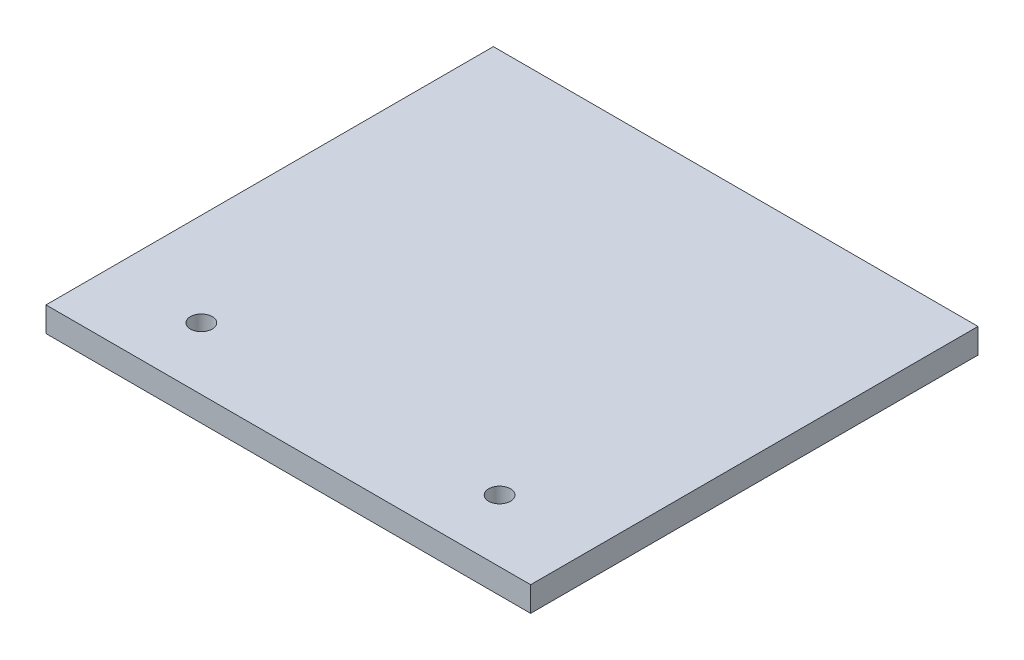
ISO-10303-21;
HEADER;
FILE_DESCRIPTION(('STEP AP214'),'2;1');
FILE_NAME('part.step','',(''),(''),'','','');
FILE_SCHEMA(('AUTOMOTIVE_DESIGN { 1 0 10303 214 1 1 1 1 }'));
ENDSEC;
DATA;
#1=APPLICATION_CONTEXT('core data for automotive mechanical design processes');
#2=APPLICATION_PROTOCOL_DEFINITION('international standard','automotive_design',2000,#1);
#3=PRODUCT_CONTEXT('',#1,'mechanical');
#4=PRODUCT('Part','Part','',(#3));
#5=PRODUCT_RELATED_PRODUCT_CATEGORY('part','',(#4));
#6=PRODUCT_DEFINITION_FORMATION('','',#4);
#7=PRODUCT_DEFINITION_CONTEXT('part definition',#1,'design');
#8=PRODUCT_DEFINITION('design','',#6,#7);
#9=PRODUCT_DEFINITION_SHAPE('','',#8);
#10=(LENGTH_UNIT() NAMED_UNIT(*) SI_UNIT(.MILLI.,.METRE.));
#11=(NAMED_UNIT(*) PLANE_ANGLE_UNIT() SI_UNIT($,.RADIAN.));
#12=(NAMED_UNIT(*) SI_UNIT($,.STERADIAN.) SOLID_ANGLE_UNIT());
#13=UNCERTAINTY_MEASURE_WITH_UNIT(LENGTH_MEASURE(1.E-05),#10,'distance_accuracy_value','');
#14=(GEOMETRIC_REPRESENTATION_CONTEXT(3) GLOBAL_UNCERTAINTY_ASSIGNED_CONTEXT((#13)) GLOBAL_UNIT_ASSIGNED_CONTEXT((#10,
#11,#12)) REPRESENTATION_CONTEXT('',''));
#15=CARTESIAN_POINT('',(0.,0.,0.));
#16=DIRECTION('',(0.,0.,1.));
#17=DIRECTION('',(1.,0.,0.));
#18=AXIS2_PLACEMENT_3D('',#15,#16,#17);
#19=CARTESIAN_POINT('',(0.,4.,0.));
#20=DIRECTION('',(0.,-1.,0.));
#21=DIRECTION('',(0.,0.,-1.));
#22=AXIS2_PLACEMENT_3D('',#19,#20,#21);
#23=PLANE('',#22);
#24=DIRECTION('',(0.,0.,1.));
#25=VECTOR('',#24,1.);
#26=CARTESIAN_POINT('',(-39.,4.,36.));
#27=LINE('',#26,#25);
#28=CARTESIAN_POINT('',(-39.,4.,-36.));
#29=VERTEX_POINT('',#28);
#30=CARTESIAN_POINT('',(-39.,4.,36.));
#31=VERTEX_POINT('',#30);
#32=EDGE_CURVE('E91',#29,#31,#27,.T.);
#33=ORIENTED_EDGE('',*,*,#32,.T.);
#34=DIRECTION('',(1.,0.,0.));
#35=VECTOR('',#34,1.);
#36=CARTESIAN_POINT('',(-39.,4.,36.));
#37=LINE('',#36,#35);
#38=CARTESIAN_POINT('',(39.,4.,36.));
#39=VERTEX_POINT('',#38);
#40=EDGE_CURVE('E86',#31,#39,#37,.T.);
#41=ORIENTED_EDGE('',*,*,#40,.T.);
#42=DIRECTION('',(0.,0.,-1.));
#43=VECTOR('',#42,1.);
#44=CARTESIAN_POINT('',(39.,4.,36.));
#45=LINE('',#44,#43);
#46=CARTESIAN_POINT('',(39.,4.,-36.));
#47=VERTEX_POINT('',#46);
#48=EDGE_CURVE('E87',#39,#47,#45,.T.);
#49=ORIENTED_EDGE('',*,*,#48,.T.);
#50=DIRECTION('',(-1.,0.,0.));
#51=VECTOR('',#50,1.);
#52=CARTESIAN_POINT('',(-39.,4.,-36.));
#53=LINE('',#52,#51);
#54=EDGE_CURVE('E57',#47,#29,#53,.T.);
#55=ORIENTED_EDGE('',*,*,#54,.T.);
#56=EDGE_LOOP('',(#33,#41,#49,#55));
#57=FACE_BOUND('',#56,.T.);
#58=CARTESIAN_POINT('',(-24.,4.,26.));
#59=DIRECTION('',(0.,1.,0.));
#60=DIRECTION('',(0.,0.,1.));
#61=AXIS2_PLACEMENT_3D('',#58,#59,#60);
#62=CIRCLE('',#61,1.75);
#63=CARTESIAN_POINT('',(-24.,4.,27.75));
#64=VERTEX_POINT('',#63);
#65=EDGE_CURVE('E106',#64,#64,#62,.T.);
#66=ORIENTED_EDGE('',*,*,#65,.F.);
#67=EDGE_LOOP('',(#66));
#68=FACE_BOUND('',#67,.T.);
#69=CARTESIAN_POINT('',(24.,4.,26.));
#70=DIRECTION('',(0.,1.,0.));
#71=DIRECTION('',(0.,0.,1.));
#72=AXIS2_PLACEMENT_3D('',#69,#70,#71);
#73=CIRCLE('',#72,1.75);
#74=CARTESIAN_POINT('',(24.,4.,27.75));
#75=VERTEX_POINT('',#74);
#76=EDGE_CURVE('E123',#75,#75,#73,.T.);
#77=ORIENTED_EDGE('',*,*,#76,.F.);
#78=EDGE_LOOP('',(#77));
#79=FACE_BOUND('',#78,.T.);
#80=ADVANCED_FACE('F39',(#57,#68,#79),#23,.F.);
#81=CARTESIAN_POINT('',(0.,0.,0.));
#82=DIRECTION('',(0.,-1.,0.));
#83=DIRECTION('',(0.,0.,-1.));
#84=AXIS2_PLACEMENT_3D('',#81,#82,#83);
#85=PLANE('',#84);
#86=CARTESIAN_POINT('',(-24.,0.,26.));
#87=DIRECTION('',(0.,1.,0.));
#88=DIRECTION('',(0.,0.,1.));
#89=AXIS2_PLACEMENT_3D('',#86,#87,#88);
#90=CIRCLE('',#89,1.75);
#91=CARTESIAN_POINT('',(-24.,0.,27.75));
#92=VERTEX_POINT('',#91);
#93=EDGE_CURVE('E119',#92,#92,#90,.T.);
#94=ORIENTED_EDGE('',*,*,#93,.T.);
#95=EDGE_LOOP('',(#94));
#96=FACE_BOUND('',#95,.T.);
#97=DIRECTION('',(0.,0.,1.));
#98=VECTOR('',#97,1.);
#99=CARTESIAN_POINT('',(-39.,0.,36.));
#100=LINE('',#99,#98);
#101=CARTESIAN_POINT('',(-39.,0.,-36.));
#102=VERTEX_POINT('',#101);
#103=CARTESIAN_POINT('',(-39.,0.,36.));
#104=VERTEX_POINT('',#103);
#105=EDGE_CURVE('E104',#102,#104,#100,.T.);
#106=ORIENTED_EDGE('',*,*,#105,.F.);
#107=DIRECTION('',(-1.,0.,0.));
#108=VECTOR('',#107,1.);
#109=CARTESIAN_POINT('',(-39.,0.,-36.));
#110=LINE('',#109,#108);
#111=CARTESIAN_POINT('',(39.,0.,-36.));
#112=VERTEX_POINT('',#111);
#113=EDGE_CURVE('E80',#112,#102,#110,.T.);
#114=ORIENTED_EDGE('',*,*,#113,.F.);
#115=DIRECTION('',(0.,0.,-1.));
#116=VECTOR('',#115,1.);
#117=CARTESIAN_POINT('',(39.,0.,36.));
#118=LINE('',#117,#116);
#119=CARTESIAN_POINT('',(39.,0.,36.));
#120=VERTEX_POINT('',#119);
#121=EDGE_CURVE('E74',#120,#112,#118,.T.);
#122=ORIENTED_EDGE('',*,*,#121,.F.);
#123=DIRECTION('',(1.,0.,0.));
#124=VECTOR('',#123,1.);
#125=CARTESIAN_POINT('',(-39.,0.,36.));
#126=LINE('',#125,#124);
#127=EDGE_CURVE('E94',#104,#120,#126,.T.);
#128=ORIENTED_EDGE('',*,*,#127,.F.);
#129=EDGE_LOOP('',(#106,#114,#122,#128));
#130=FACE_BOUND('',#129,.T.);
#131=CARTESIAN_POINT('',(24.,0.,26.));
#132=DIRECTION('',(0.,1.,0.));
#133=DIRECTION('',(0.,0.,1.));
#134=AXIS2_PLACEMENT_3D('',#131,#132,#133);
#135=CIRCLE('',#134,1.75);
#136=CARTESIAN_POINT('',(24.,0.,27.75));
#137=VERTEX_POINT('',#136);
#138=EDGE_CURVE('E125',#137,#137,#135,.T.);
#139=ORIENTED_EDGE('',*,*,#138,.T.);
#140=EDGE_LOOP('',(#139));
#141=FACE_BOUND('',#140,.T.);
#142=ADVANCED_FACE('F114',(#96,#130,#141),#85,.T.);
#143=CARTESIAN_POINT('',(-39.,4.,36.));
#144=DIRECTION('',(1.,0.,0.));
#145=DIRECTION('',(0.,0.,-1.));
#146=AXIS2_PLACEMENT_3D('',#143,#144,#145);
#147=PLANE('',#146);
#148=ORIENTED_EDGE('',*,*,#105,.T.);
#149=DIRECTION('',(0.,-1.,0.));
#150=VECTOR('',#149,1.);
#151=CARTESIAN_POINT('',(-39.,4.,36.));
#152=LINE('',#151,#150);
#153=EDGE_CURVE('E11',#31,#104,#152,.T.);
#154=ORIENTED_EDGE('',*,*,#153,.F.);
#155=ORIENTED_EDGE('',*,*,#32,.F.);
#156=DIRECTION('',(0.,-1.,0.));
#157=VECTOR('',#156,1.);
#158=CARTESIAN_POINT('',(-39.,4.,-36.));
#159=LINE('',#158,#157);
#160=EDGE_CURVE('E98',#29,#102,#159,.T.);
#161=ORIENTED_EDGE('',*,*,#160,.T.);
#162=EDGE_LOOP('',(#148,#154,#155,#161));
#163=FACE_BOUND('',#162,.T.);
#164=ADVANCED_FACE('F41',(#163),#147,.F.);
#165=CARTESIAN_POINT('',(-39.,4.,36.));
#166=DIRECTION('',(0.,0.,-1.));
#167=DIRECTION('',(-1.,0.,0.));
#168=AXIS2_PLACEMENT_3D('',#165,#166,#167);
#169=PLANE('',#168);
#170=ORIENTED_EDGE('',*,*,#127,.T.);
#171=DIRECTION('',(0.,-1.,0.));
#172=VECTOR('',#171,1.);
#173=CARTESIAN_POINT('',(39.,4.,36.));
#174=LINE('',#173,#172);
#175=EDGE_CURVE('E48',#39,#120,#174,.T.);
#176=ORIENTED_EDGE('',*,*,#175,.F.);
#177=ORIENTED_EDGE('',*,*,#40,.F.);
#178=ORIENTED_EDGE('',*,*,#153,.T.);
#179=EDGE_LOOP('',(#170,#176,#177,#178));
#180=FACE_BOUND('',#179,.T.);
#181=ADVANCED_FACE('F92',(#180),#169,.F.);
#182=CARTESIAN_POINT('',(39.,4.,36.));
#183=DIRECTION('',(-1.,0.,0.));
#184=DIRECTION('',(0.,0.,1.));
#185=AXIS2_PLACEMENT_3D('',#182,#183,#184);
#186=PLANE('',#185);
#187=ORIENTED_EDGE('',*,*,#121,.T.);
#188=DIRECTION('',(0.,-1.,0.));
#189=VECTOR('',#188,1.);
#190=CARTESIAN_POINT('',(39.,4.,-36.));
#191=LINE('',#190,#189);
#192=EDGE_CURVE('E96',#47,#112,#191,.T.);
#193=ORIENTED_EDGE('',*,*,#192,.F.);
#194=ORIENTED_EDGE('',*,*,#48,.F.);
#195=ORIENTED_EDGE('',*,*,#175,.T.);
#196=EDGE_LOOP('',(#187,#193,#194,#195));
#197=FACE_BOUND('',#196,.T.);
#198=ADVANCED_FACE('F100',(#197),#186,.F.);
#199=CARTESIAN_POINT('',(-39.,4.,-36.));
#200=DIRECTION('',(0.,0.,1.));
#201=DIRECTION('',(1.,0.,0.));
#202=AXIS2_PLACEMENT_3D('',#199,#200,#201);
#203=PLANE('',#202);
#204=ORIENTED_EDGE('',*,*,#113,.T.);
#205=ORIENTED_EDGE('',*,*,#160,.F.);
#206=ORIENTED_EDGE('',*,*,#54,.F.);
#207=ORIENTED_EDGE('',*,*,#192,.T.);
#208=EDGE_LOOP('',(#204,#205,#206,#207));
#209=FACE_BOUND('',#208,.T.);
#210=ADVANCED_FACE('F112',(#209),#203,.F.);
#211=CARTESIAN_POINT('',(-24.,4.,26.));
#212=DIRECTION('',(0.,-1.,0.));
#213=DIRECTION('',(0.,0.,-1.));
#214=AXIS2_PLACEMENT_3D('',#211,#212,#213);
#215=CYLINDRICAL_SURFACE('',#214,1.75);
#216=ORIENTED_EDGE('',*,*,#65,.T.);
#217=EDGE_LOOP('',(#216));
#218=FACE_BOUND('',#217,.T.);
#219=ORIENTED_EDGE('',*,*,#93,.F.);
#220=EDGE_LOOP('',(#219));
#221=FACE_BOUND('',#220,.T.);
#222=ADVANCED_FACE('F141',(#218,#221),#215,.F.);
#223=CARTESIAN_POINT('',(24.,4.,26.));
#224=DIRECTION('',(0.,-1.,0.));
#225=DIRECTION('',(0.,0.,-1.));
#226=AXIS2_PLACEMENT_3D('',#223,#224,#225);
#227=CYLINDRICAL_SURFACE('',#226,1.75);
#228=ORIENTED_EDGE('',*,*,#76,.T.);
#229=EDGE_LOOP('',(#228));
#230=FACE_BOUND('',#229,.T.);
#231=ORIENTED_EDGE('',*,*,#138,.F.);
#232=EDGE_LOOP('',(#231));
#233=FACE_BOUND('',#232,.T.);
#234=ADVANCED_FACE('F127',(#230,#233),#227,.F.);
#235=CLOSED_SHELL('',(#80,#142,#164,#181,#198,#210,#222,#234));
#236=MANIFOLD_SOLID_BREP('B2',#235);
#237=ADVANCED_BREP_SHAPE_REPRESENTATION('',(#18,#236),#14);
#238=SHAPE_DEFINITION_REPRESENTATION(#9,#237);
ENDSEC;
END-ISO-10303-21;
